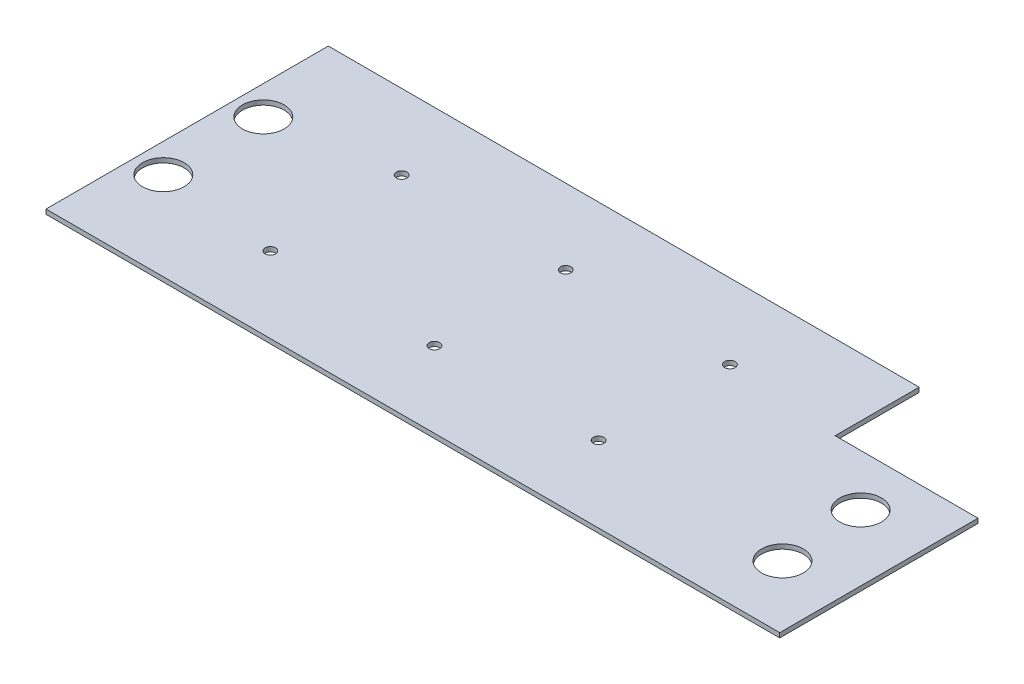
ISO-10303-21;
HEADER;
FILE_DESCRIPTION(('STEP AP214'),'2;1');
FILE_NAME('part.step','',(''),(''),'','','');
FILE_SCHEMA(('AUTOMOTIVE_DESIGN { 1 0 10303 214 1 1 1 1 }'));
ENDSEC;
DATA;
#1=APPLICATION_CONTEXT('core data for automotive mechanical design processes');
#2=APPLICATION_PROTOCOL_DEFINITION('international standard','automotive_design',2000,#1);
#3=PRODUCT_CONTEXT('',#1,'mechanical');
#4=PRODUCT('Part','Part','',(#3));
#5=PRODUCT_RELATED_PRODUCT_CATEGORY('part','',(#4));
#6=PRODUCT_DEFINITION_FORMATION('','',#4);
#7=PRODUCT_DEFINITION_CONTEXT('part definition',#1,'design');
#8=PRODUCT_DEFINITION('design','',#6,#7);
#9=PRODUCT_DEFINITION_SHAPE('','',#8);
#10=(LENGTH_UNIT() NAMED_UNIT(*) SI_UNIT(.MILLI.,.METRE.));
#11=(NAMED_UNIT(*) PLANE_ANGLE_UNIT() SI_UNIT($,.RADIAN.));
#12=(NAMED_UNIT(*) SI_UNIT($,.STERADIAN.) SOLID_ANGLE_UNIT());
#13=UNCERTAINTY_MEASURE_WITH_UNIT(LENGTH_MEASURE(1.E-05),#10,'distance_accuracy_value','');
#14=(GEOMETRIC_REPRESENTATION_CONTEXT(3) GLOBAL_UNCERTAINTY_ASSIGNED_CONTEXT((#13)) GLOBAL_UNIT_ASSIGNED_CONTEXT((#10,
#11,#12)) REPRESENTATION_CONTEXT('',''));
#15=CARTESIAN_POINT('',(0.,0.,0.));
#16=DIRECTION('',(0.,0.,1.));
#17=DIRECTION('',(1.,0.,0.));
#18=AXIS2_PLACEMENT_3D('',#15,#16,#17);
#19=CARTESIAN_POINT('',(558.8,3.5,0.));
#20=DIRECTION('',(0.,0.,-1.));
#21=DIRECTION('',(-1.,0.,0.));
#22=AXIS2_PLACEMENT_3D('',#19,#20,#21);
#23=PLANE('',#22);
#24=DIRECTION('',(1.,0.,0.));
#25=VECTOR('',#24,1.);
#26=CARTESIAN_POINT('',(558.8,0.,0.));
#27=LINE('',#26,#25);
#28=CARTESIAN_POINT('',(0.,0.,0.));
#29=VERTEX_POINT('',#28);
#30=CARTESIAN_POINT('',(558.8,0.,0.));
#31=VERTEX_POINT('',#30);
#32=EDGE_CURVE('E128',#29,#31,#27,.T.);
#33=ORIENTED_EDGE('',*,*,#32,.T.);
#34=DIRECTION('',(0.,-1.,0.));
#35=VECTOR('',#34,1.);
#36=CARTESIAN_POINT('',(558.8,3.5,0.));
#37=LINE('',#36,#35);
#38=CARTESIAN_POINT('',(558.8,3.5,0.));
#39=VERTEX_POINT('',#38);
#40=EDGE_CURVE('E11',#39,#31,#37,.T.);
#41=ORIENTED_EDGE('',*,*,#40,.F.);
#42=DIRECTION('',(1.,0.,0.));
#43=VECTOR('',#42,1.);
#44=CARTESIAN_POINT('',(558.8,3.5,0.));
#45=LINE('',#44,#43);
#46=CARTESIAN_POINT('',(0.,3.5,0.));
#47=VERTEX_POINT('',#46);
#48=EDGE_CURVE('E136',#47,#39,#45,.T.);
#49=ORIENTED_EDGE('',*,*,#48,.F.);
#50=DIRECTION('',(0.,-1.,0.));
#51=VECTOR('',#50,1.);
#52=CARTESIAN_POINT('',(0.,3.5,0.));
#53=LINE('',#52,#51);
#54=EDGE_CURVE('E123',#47,#29,#53,.T.);
#55=ORIENTED_EDGE('',*,*,#54,.T.);
#56=EDGE_LOOP('',(#33,#41,#49,#55));
#57=FACE_BOUND('',#56,.T.);
#58=ADVANCED_FACE('F43',(#57),#23,.F.);
#59=CARTESIAN_POINT('',(558.8,3.5,-151.));
#60=DIRECTION('',(-1.,0.,0.));
#61=DIRECTION('',(0.,0.,1.));
#62=AXIS2_PLACEMENT_3D('',#59,#60,#61);
#63=PLANE('',#62);
#64=DIRECTION('',(0.,0.,-1.));
#65=VECTOR('',#64,1.);
#66=CARTESIAN_POINT('',(558.8,0.,-151.));
#67=LINE('',#66,#65);
#68=CARTESIAN_POINT('',(558.8,0.,-151.));
#69=VERTEX_POINT('',#68);
#70=EDGE_CURVE('E135',#31,#69,#67,.T.);
#71=ORIENTED_EDGE('',*,*,#70,.T.);
#72=DIRECTION('',(0.,-1.,0.));
#73=VECTOR('',#72,1.);
#74=CARTESIAN_POINT('',(558.8,3.5,-151.));
#75=LINE('',#74,#73);
#76=CARTESIAN_POINT('',(558.8,3.5,-151.));
#77=VERTEX_POINT('',#76);
#78=EDGE_CURVE('E55',#77,#69,#75,.T.);
#79=ORIENTED_EDGE('',*,*,#78,.F.);
#80=DIRECTION('',(0.,0.,-1.));
#81=VECTOR('',#80,1.);
#82=CARTESIAN_POINT('',(558.8,3.5,-151.));
#83=LINE('',#82,#81);
#84=EDGE_CURVE('E96',#39,#77,#83,.T.);
#85=ORIENTED_EDGE('',*,*,#84,.F.);
#86=ORIENTED_EDGE('',*,*,#40,.T.);
#87=EDGE_LOOP('',(#71,#79,#85,#86));
#88=FACE_BOUND('',#87,.T.);
#89=ADVANCED_FACE('F193',(#88),#63,.F.);
#90=CARTESIAN_POINT('',(450.,3.5,-151.));
#91=DIRECTION('',(0.,0.,1.));
#92=DIRECTION('',(1.,0.,0.));
#93=AXIS2_PLACEMENT_3D('',#90,#91,#92);
#94=PLANE('',#93);
#95=DIRECTION('',(-1.,0.,0.));
#96=VECTOR('',#95,1.);
#97=CARTESIAN_POINT('',(450.,0.,-151.));
#98=LINE('',#97,#96);
#99=CARTESIAN_POINT('',(450.,0.,-151.));
#100=VERTEX_POINT('',#99);
#101=EDGE_CURVE('E134',#69,#100,#98,.T.);
#102=ORIENTED_EDGE('',*,*,#101,.T.);
#103=DIRECTION('',(0.,-1.,0.));
#104=VECTOR('',#103,1.);
#105=CARTESIAN_POINT('',(450.,3.5,-151.));
#106=LINE('',#105,#104);
#107=CARTESIAN_POINT('',(450.,3.5,-151.));
#108=VERTEX_POINT('',#107);
#109=EDGE_CURVE('E119',#108,#100,#106,.T.);
#110=ORIENTED_EDGE('',*,*,#109,.F.);
#111=DIRECTION('',(-1.,0.,0.));
#112=VECTOR('',#111,1.);
#113=CARTESIAN_POINT('',(450.,3.5,-151.));
#114=LINE('',#113,#112);
#115=EDGE_CURVE('E111',#77,#108,#114,.T.);
#116=ORIENTED_EDGE('',*,*,#115,.F.);
#117=ORIENTED_EDGE('',*,*,#78,.T.);
#118=EDGE_LOOP('',(#102,#110,#116,#117));
#119=FACE_BOUND('',#118,.T.);
#120=ADVANCED_FACE('F200',(#119),#94,.F.);
#121=CARTESIAN_POINT('',(450.,3.5,-215.));
#122=DIRECTION('',(-1.,0.,0.));
#123=DIRECTION('',(0.,0.,1.));
#124=AXIS2_PLACEMENT_3D('',#121,#122,#123);
#125=PLANE('',#124);
#126=DIRECTION('',(0.,0.,-1.));
#127=VECTOR('',#126,1.);
#128=CARTESIAN_POINT('',(450.,0.,-215.));
#129=LINE('',#128,#127);
#130=CARTESIAN_POINT('',(450.,0.,-215.));
#131=VERTEX_POINT('',#130);
#132=EDGE_CURVE('E118',#100,#131,#129,.T.);
#133=ORIENTED_EDGE('',*,*,#132,.T.);
#134=DIRECTION('',(0.,-1.,0.));
#135=VECTOR('',#134,1.);
#136=CARTESIAN_POINT('',(450.,3.5,-215.));
#137=LINE('',#136,#135);
#138=CARTESIAN_POINT('',(450.,3.5,-215.));
#139=VERTEX_POINT('',#138);
#140=EDGE_CURVE('E116',#139,#131,#137,.T.);
#141=ORIENTED_EDGE('',*,*,#140,.F.);
#142=DIRECTION('',(0.,0.,-1.));
#143=VECTOR('',#142,1.);
#144=CARTESIAN_POINT('',(450.,3.5,-215.));
#145=LINE('',#144,#143);
#146=EDGE_CURVE('E102',#108,#139,#145,.T.);
#147=ORIENTED_EDGE('',*,*,#146,.F.);
#148=ORIENTED_EDGE('',*,*,#109,.T.);
#149=EDGE_LOOP('',(#133,#141,#147,#148));
#150=FACE_BOUND('',#149,.T.);
#151=ADVANCED_FACE('F120',(#150),#125,.F.);
#152=CARTESIAN_POINT('',(0.,3.5,-215.));
#153=DIRECTION('',(0.,0.,1.));
#154=DIRECTION('',(1.,0.,0.));
#155=AXIS2_PLACEMENT_3D('',#152,#153,#154);
#156=PLANE('',#155);
#157=DIRECTION('',(-1.,0.,0.));
#158=VECTOR('',#157,1.);
#159=CARTESIAN_POINT('',(0.,0.,-215.));
#160=LINE('',#159,#158);
#161=CARTESIAN_POINT('',(0.,0.,-215.));
#162=VERTEX_POINT('',#161);
#163=EDGE_CURVE('E83',#131,#162,#160,.T.);
#164=ORIENTED_EDGE('',*,*,#163,.T.);
#165=DIRECTION('',(0.,-1.,0.));
#166=VECTOR('',#165,1.);
#167=CARTESIAN_POINT('',(0.,3.5,-215.));
#168=LINE('',#167,#166);
#169=CARTESIAN_POINT('',(0.,3.5,-215.));
#170=VERTEX_POINT('',#169);
#171=EDGE_CURVE('E122',#170,#162,#168,.T.);
#172=ORIENTED_EDGE('',*,*,#171,.F.);
#173=DIRECTION('',(-1.,0.,0.));
#174=VECTOR('',#173,1.);
#175=CARTESIAN_POINT('',(0.,3.5,-215.));
#176=LINE('',#175,#174);
#177=EDGE_CURVE('E107',#139,#170,#176,.T.);
#178=ORIENTED_EDGE('',*,*,#177,.F.);
#179=ORIENTED_EDGE('',*,*,#140,.T.);
#180=EDGE_LOOP('',(#164,#172,#178,#179));
#181=FACE_BOUND('',#180,.T.);
#182=ADVANCED_FACE('F124',(#181),#156,.F.);
#183=CARTESIAN_POINT('',(0.,3.5,0.));
#184=DIRECTION('',(1.,0.,0.));
#185=DIRECTION('',(0.,0.,-1.));
#186=AXIS2_PLACEMENT_3D('',#183,#184,#185);
#187=PLANE('',#186);
#188=DIRECTION('',(0.,0.,1.));
#189=VECTOR('',#188,1.);
#190=CARTESIAN_POINT('',(0.,0.,0.));
#191=LINE('',#190,#189);
#192=EDGE_CURVE('E89',#162,#29,#191,.T.);
#193=ORIENTED_EDGE('',*,*,#192,.T.);
#194=ORIENTED_EDGE('',*,*,#54,.F.);
#195=DIRECTION('',(0.,0.,1.));
#196=VECTOR('',#195,1.);
#197=CARTESIAN_POINT('',(0.,3.5,0.));
#198=LINE('',#197,#196);
#199=EDGE_CURVE('E61',#170,#47,#198,.T.);
#200=ORIENTED_EDGE('',*,*,#199,.F.);
#201=ORIENTED_EDGE('',*,*,#171,.T.);
#202=EDGE_LOOP('',(#193,#194,#200,#201));
#203=FACE_BOUND('',#202,.T.);
#204=ADVANCED_FACE('F204',(#203),#187,.F.);
#205=CARTESIAN_POINT('',(0.,3.5,0.));
#206=DIRECTION('',(0.,-1.,0.));
#207=DIRECTION('',(0.,0.,-1.));
#208=AXIS2_PLACEMENT_3D('',#205,#206,#207);
#209=PLANE('',#208);
#210=CARTESIAN_POINT('',(21.9771584819898,3.5,-143.521297983205));
#211=DIRECTION('',(0.,1.,0.));
#212=DIRECTION('',(0.,0.,1.));
#213=AXIS2_PLACEMENT_3D('',#210,#211,#212);
#214=CIRCLE('',#213,15.875);
#215=CARTESIAN_POINT('',(21.9771584819898,3.5,-127.646297983205));
#216=VERTEX_POINT('',#215);
#217=EDGE_CURVE('E149',#216,#216,#214,.T.);
#218=ORIENTED_EDGE('',*,*,#217,.F.);
#219=EDGE_LOOP('',(#218));
#220=FACE_BOUND('',#219,.T.);
#221=CARTESIAN_POINT('',(22.024999999998,3.5,-67.32131300165));
#222=DIRECTION('',(0.,1.,0.));
#223=DIRECTION('',(0.,0.,1.));
#224=AXIS2_PLACEMENT_3D('',#221,#222,#223);
#225=CIRCLE('',#224,15.875);
#226=CARTESIAN_POINT('',(22.024999999998,3.5,-51.44631300165));
#227=VERTEX_POINT('',#226);
#228=EDGE_CURVE('E351',#227,#227,#225,.T.);
#229=ORIENTED_EDGE('',*,*,#228,.F.);
#230=EDGE_LOOP('',(#229));
#231=FACE_BOUND('',#230,.T.);
#232=CARTESIAN_POINT('',(512.517444600135,3.5,-48.3496617312163));
#233=DIRECTION('',(0.,1.,0.));
#234=DIRECTION('',(0.,0.,1.));
#235=AXIS2_PLACEMENT_3D('',#232,#233,#234);
#236=CIRCLE('',#235,15.875);
#237=CARTESIAN_POINT('',(512.517444600135,3.5,-32.4746617312163));
#238=VERTEX_POINT('',#237);
#239=EDGE_CURVE('E356',#238,#238,#236,.T.);
#240=ORIENTED_EDGE('',*,*,#239,.F.);
#241=EDGE_LOOP('',(#240));
#242=FACE_BOUND('',#241,.T.);
#243=CARTESIAN_POINT('',(508.667649246363,3.5,-111.732854106909));
#244=DIRECTION('',(0.,1.,0.));
#245=DIRECTION('',(0.,0.,1.));
#246=AXIS2_PLACEMENT_3D('',#243,#244,#245);
#247=CIRCLE('',#246,15.875);
#248=CARTESIAN_POINT('',(508.667649246363,3.5,-95.8578541069091));
#249=VERTEX_POINT('',#248);
#250=EDGE_CURVE('E361',#249,#249,#247,.T.);
#251=ORIENTED_EDGE('',*,*,#250,.F.);
#252=EDGE_LOOP('',(#251));
#253=FACE_BOUND('',#252,.T.);
#254=CARTESIAN_POINT('',(113.,3.5,-57.85));
#255=DIRECTION('',(0.,-1.,0.));
#256=DIRECTION('',(0.,0.,-1.));
#257=AXIS2_PLACEMENT_3D('',#254,#255,#256);
#258=CIRCLE('',#257,4.00000000000001);
#259=CARTESIAN_POINT('',(113.,3.5,-61.85));
#260=VERTEX_POINT('',#259);
#261=EDGE_CURVE('E131',#260,#260,#258,.T.);
#262=ORIENTED_EDGE('',*,*,#261,.T.);
#263=EDGE_LOOP('',(#262));
#264=FACE_BOUND('',#263,.T.);
#265=CARTESIAN_POINT('',(238.,3.5,-57.85));
#266=DIRECTION('',(0.,-1.,0.));
#267=DIRECTION('',(0.,0.,-1.));
#268=AXIS2_PLACEMENT_3D('',#265,#266,#267);
#269=CIRCLE('',#268,3.99999999999999);
#270=CARTESIAN_POINT('',(238.,3.5,-61.85));
#271=VERTEX_POINT('',#270);
#272=EDGE_CURVE('E187',#271,#271,#269,.T.);
#273=ORIENTED_EDGE('',*,*,#272,.T.);
#274=EDGE_LOOP('',(#273));
#275=FACE_BOUND('',#274,.T.);
#276=CARTESIAN_POINT('',(363.,3.5,-57.85));
#277=DIRECTION('',(0.,-1.,0.));
#278=DIRECTION('',(0.,0.,-1.));
#279=AXIS2_PLACEMENT_3D('',#276,#277,#278);
#280=CIRCLE('',#279,3.99999999999999);
#281=CARTESIAN_POINT('',(363.,3.5,-61.85));
#282=VERTEX_POINT('',#281);
#283=EDGE_CURVE('E182',#282,#282,#280,.T.);
#284=ORIENTED_EDGE('',*,*,#283,.T.);
#285=EDGE_LOOP('',(#284));
#286=FACE_BOUND('',#285,.T.);
#287=CARTESIAN_POINT('',(363.,3.5,-157.85));
#288=DIRECTION('',(0.,-1.,0.));
#289=DIRECTION('',(0.,0.,-1.));
#290=AXIS2_PLACEMENT_3D('',#287,#288,#289);
#291=CIRCLE('',#290,3.99999999999999);
#292=CARTESIAN_POINT('',(363.,3.5,-161.85));
#293=VERTEX_POINT('',#292);
#294=EDGE_CURVE('E179',#293,#293,#291,.T.);
#295=ORIENTED_EDGE('',*,*,#294,.T.);
#296=EDGE_LOOP('',(#295));
#297=FACE_BOUND('',#296,.T.);
#298=CARTESIAN_POINT('',(238.,3.5,-157.85));
#299=DIRECTION('',(0.,-1.,0.));
#300=DIRECTION('',(0.,0.,-1.));
#301=AXIS2_PLACEMENT_3D('',#298,#299,#300);
#302=CIRCLE('',#301,3.99999999999999);
#303=CARTESIAN_POINT('',(238.,3.5,-161.85));
#304=VERTEX_POINT('',#303);
#305=EDGE_CURVE('E180',#304,#304,#302,.T.);
#306=ORIENTED_EDGE('',*,*,#305,.T.);
#307=EDGE_LOOP('',(#306));
#308=FACE_BOUND('',#307,.T.);
#309=CARTESIAN_POINT('',(113.,3.5,-157.85));
#310=DIRECTION('',(0.,-1.,0.));
#311=DIRECTION('',(0.,0.,-1.));
#312=AXIS2_PLACEMENT_3D('',#309,#310,#311);
#313=CIRCLE('',#312,4.00000000000001);
#314=CARTESIAN_POINT('',(113.,3.5,-161.85));
#315=VERTEX_POINT('',#314);
#316=EDGE_CURVE('E173',#315,#315,#313,.T.);
#317=ORIENTED_EDGE('',*,*,#316,.T.);
#318=EDGE_LOOP('',(#317));
#319=FACE_BOUND('',#318,.T.);
#320=ORIENTED_EDGE('',*,*,#48,.T.);
#321=ORIENTED_EDGE('',*,*,#84,.T.);
#322=ORIENTED_EDGE('',*,*,#115,.T.);
#323=ORIENTED_EDGE('',*,*,#146,.T.);
#324=ORIENTED_EDGE('',*,*,#177,.T.);
#325=ORIENTED_EDGE('',*,*,#199,.T.);
#326=EDGE_LOOP('',(#320,#321,#322,#323,#324,#325));
#327=FACE_BOUND('',#326,.T.);
#328=ADVANCED_FACE('F110',(#220,#231,#242,#253,#264,#275,#286,#297,#308,#319,#327),#209,.F.);
#329=CARTESIAN_POINT('',(0.,0.,0.));
#330=DIRECTION('',(0.,-1.,0.));
#331=DIRECTION('',(0.,0.,-1.));
#332=AXIS2_PLACEMENT_3D('',#329,#330,#331);
#333=PLANE('',#332);
#334=CARTESIAN_POINT('',(21.9771584819898,0.,-143.521297983205));
#335=DIRECTION('',(0.,-1.,0.));
#336=DIRECTION('',(0.,0.,-1.));
#337=AXIS2_PLACEMENT_3D('',#334,#335,#336);
#338=CIRCLE('',#337,15.875);
#339=CARTESIAN_POINT('',(21.9771584819898,0.,-159.396297983205));
#340=VERTEX_POINT('',#339);
#341=EDGE_CURVE('E46',#340,#340,#338,.T.);
#342=ORIENTED_EDGE('',*,*,#341,.F.);
#343=EDGE_LOOP('',(#342));
#344=FACE_BOUND('',#343,.T.);
#345=CARTESIAN_POINT('',(22.024999999998,0.,-67.32131300165));
#346=DIRECTION('',(0.,-1.,0.));
#347=DIRECTION('',(0.,0.,-1.));
#348=AXIS2_PLACEMENT_3D('',#345,#346,#347);
#349=CIRCLE('',#348,15.875);
#350=CARTESIAN_POINT('',(22.024999999998,0.,-83.19631300165));
#351=VERTEX_POINT('',#350);
#352=EDGE_CURVE('E155',#351,#351,#349,.T.);
#353=ORIENTED_EDGE('',*,*,#352,.F.);
#354=EDGE_LOOP('',(#353));
#355=FACE_BOUND('',#354,.T.);
#356=CARTESIAN_POINT('',(512.517444600135,0.,-48.3496617312163));
#357=DIRECTION('',(0.,-1.,0.));
#358=DIRECTION('',(0.,0.,-1.));
#359=AXIS2_PLACEMENT_3D('',#356,#357,#358);
#360=CIRCLE('',#359,15.875);
#361=CARTESIAN_POINT('',(512.517444600135,0.,-64.2246617312162));
#362=VERTEX_POINT('',#361);
#363=EDGE_CURVE('E148',#362,#362,#360,.T.);
#364=ORIENTED_EDGE('',*,*,#363,.F.);
#365=EDGE_LOOP('',(#364));
#366=FACE_BOUND('',#365,.T.);
#367=CARTESIAN_POINT('',(508.667649246363,0.,-111.732854106909));
#368=DIRECTION('',(0.,-1.,0.));
#369=DIRECTION('',(0.,0.,-1.));
#370=AXIS2_PLACEMENT_3D('',#367,#368,#369);
#371=CIRCLE('',#370,15.875);
#372=CARTESIAN_POINT('',(508.667649246363,0.,-127.607854106909));
#373=VERTEX_POINT('',#372);
#374=EDGE_CURVE('E146',#373,#373,#371,.T.);
#375=ORIENTED_EDGE('',*,*,#374,.F.);
#376=EDGE_LOOP('',(#375));
#377=FACE_BOUND('',#376,.T.);
#378=CARTESIAN_POINT('',(113.,0.,-57.85));
#379=DIRECTION('',(0.,1.,0.));
#380=DIRECTION('',(0.,0.,1.));
#381=AXIS2_PLACEMENT_3D('',#378,#379,#380);
#382=CIRCLE('',#381,4.00000000000001);
#383=CARTESIAN_POINT('',(113.,0.,-53.85));
#384=VERTEX_POINT('',#383);
#385=EDGE_CURVE('E159',#384,#384,#382,.T.);
#386=ORIENTED_EDGE('',*,*,#385,.T.);
#387=EDGE_LOOP('',(#386));
#388=FACE_BOUND('',#387,.T.);
#389=CARTESIAN_POINT('',(238.,0.,-57.85));
#390=DIRECTION('',(0.,1.,0.));
#391=DIRECTION('',(0.,0.,1.));
#392=AXIS2_PLACEMENT_3D('',#389,#390,#391);
#393=CIRCLE('',#392,3.99999999999999);
#394=CARTESIAN_POINT('',(238.,0.,-53.85));
#395=VERTEX_POINT('',#394);
#396=EDGE_CURVE('E163',#395,#395,#393,.T.);
#397=ORIENTED_EDGE('',*,*,#396,.T.);
#398=EDGE_LOOP('',(#397));
#399=FACE_BOUND('',#398,.T.);
#400=CARTESIAN_POINT('',(363.,0.,-57.85));
#401=DIRECTION('',(0.,1.,0.));
#402=DIRECTION('',(0.,0.,1.));
#403=AXIS2_PLACEMENT_3D('',#400,#401,#402);
#404=CIRCLE('',#403,3.99999999999999);
#405=CARTESIAN_POINT('',(363.,0.,-53.85));
#406=VERTEX_POINT('',#405);
#407=EDGE_CURVE('E168',#406,#406,#404,.T.);
#408=ORIENTED_EDGE('',*,*,#407,.T.);
#409=EDGE_LOOP('',(#408));
#410=FACE_BOUND('',#409,.T.);
#411=CARTESIAN_POINT('',(363.,0.,-157.85));
#412=DIRECTION('',(0.,1.,0.));
#413=DIRECTION('',(0.,0.,1.));
#414=AXIS2_PLACEMENT_3D('',#411,#412,#413);
#415=CIRCLE('',#414,3.99999999999999);
#416=CARTESIAN_POINT('',(363.,0.,-153.85));
#417=VERTEX_POINT('',#416);
#418=EDGE_CURVE('E368',#417,#417,#415,.T.);
#419=ORIENTED_EDGE('',*,*,#418,.T.);
#420=EDGE_LOOP('',(#419));
#421=FACE_BOUND('',#420,.T.);
#422=CARTESIAN_POINT('',(238.,0.,-157.85));
#423=DIRECTION('',(0.,1.,0.));
#424=DIRECTION('',(0.,0.,1.));
#425=AXIS2_PLACEMENT_3D('',#422,#423,#424);
#426=CIRCLE('',#425,3.99999999999999);
#427=CARTESIAN_POINT('',(238.,0.,-153.85));
#428=VERTEX_POINT('',#427);
#429=EDGE_CURVE('E172',#428,#428,#426,.T.);
#430=ORIENTED_EDGE('',*,*,#429,.T.);
#431=EDGE_LOOP('',(#430));
#432=FACE_BOUND('',#431,.T.);
#433=CARTESIAN_POINT('',(113.,0.,-157.85));
#434=DIRECTION('',(0.,1.,0.));
#435=DIRECTION('',(0.,0.,1.));
#436=AXIS2_PLACEMENT_3D('',#433,#434,#435);
#437=CIRCLE('',#436,4.00000000000001);
#438=CARTESIAN_POINT('',(113.,0.,-153.85));
#439=VERTEX_POINT('',#438);
#440=EDGE_CURVE('E167',#439,#439,#437,.T.);
#441=ORIENTED_EDGE('',*,*,#440,.T.);
#442=EDGE_LOOP('',(#441));
#443=FACE_BOUND('',#442,.T.);
#444=ORIENTED_EDGE('',*,*,#32,.F.);
#445=ORIENTED_EDGE('',*,*,#192,.F.);
#446=ORIENTED_EDGE('',*,*,#163,.F.);
#447=ORIENTED_EDGE('',*,*,#132,.F.);
#448=ORIENTED_EDGE('',*,*,#101,.F.);
#449=ORIENTED_EDGE('',*,*,#70,.F.);
#450=EDGE_LOOP('',(#444,#445,#446,#447,#448,#449));
#451=FACE_BOUND('',#450,.T.);
#452=ADVANCED_FACE('F199',(#344,#355,#366,#377,#388,#399,#410,#421,#432,#443,#451),#333,.T.);
#453=CARTESIAN_POINT('',(113.,0.,-157.85));
#454=DIRECTION('',(0.,1.,0.));
#455=DIRECTION('',(0.,0.,1.));
#456=AXIS2_PLACEMENT_3D('',#453,#454,#455);
#457=CYLINDRICAL_SURFACE('',#456,4.00000000000001);
#458=ORIENTED_EDGE('',*,*,#440,.F.);
#459=EDGE_LOOP('',(#458));
#460=FACE_BOUND('',#459,.T.);
#461=ORIENTED_EDGE('',*,*,#316,.F.);
#462=EDGE_LOOP('',(#461));
#463=FACE_BOUND('',#462,.T.);
#464=ADVANCED_FACE('F251',(#460,#463),#457,.F.);
#465=CARTESIAN_POINT('',(238.,0.,-157.85));
#466=DIRECTION('',(0.,1.,0.));
#467=DIRECTION('',(0.,0.,1.));
#468=AXIS2_PLACEMENT_3D('',#465,#466,#467);
#469=CYLINDRICAL_SURFACE('',#468,3.99999999999999);
#470=ORIENTED_EDGE('',*,*,#429,.F.);
#471=EDGE_LOOP('',(#470));
#472=FACE_BOUND('',#471,.T.);
#473=ORIENTED_EDGE('',*,*,#305,.F.);
#474=EDGE_LOOP('',(#473));
#475=FACE_BOUND('',#474,.T.);
#476=ADVANCED_FACE('F261',(#472,#475),#469,.F.);
#477=CARTESIAN_POINT('',(363.,0.,-157.85));
#478=DIRECTION('',(0.,1.,0.));
#479=DIRECTION('',(0.,0.,1.));
#480=AXIS2_PLACEMENT_3D('',#477,#478,#479);
#481=CYLINDRICAL_SURFACE('',#480,3.99999999999999);
#482=ORIENTED_EDGE('',*,*,#418,.F.);
#483=EDGE_LOOP('',(#482));
#484=FACE_BOUND('',#483,.T.);
#485=ORIENTED_EDGE('',*,*,#294,.F.);
#486=EDGE_LOOP('',(#485));
#487=FACE_BOUND('',#486,.T.);
#488=ADVANCED_FACE('F271',(#484,#487),#481,.F.);
#489=CARTESIAN_POINT('',(363.,0.,-57.85));
#490=DIRECTION('',(0.,1.,0.));
#491=DIRECTION('',(0.,0.,1.));
#492=AXIS2_PLACEMENT_3D('',#489,#490,#491);
#493=CYLINDRICAL_SURFACE('',#492,3.99999999999999);
#494=ORIENTED_EDGE('',*,*,#407,.F.);
#495=EDGE_LOOP('',(#494));
#496=FACE_BOUND('',#495,.T.);
#497=ORIENTED_EDGE('',*,*,#283,.F.);
#498=EDGE_LOOP('',(#497));
#499=FACE_BOUND('',#498,.T.);
#500=ADVANCED_FACE('F281',(#496,#499),#493,.F.);
#501=CARTESIAN_POINT('',(238.,0.,-57.85));
#502=DIRECTION('',(0.,1.,0.));
#503=DIRECTION('',(0.,0.,1.));
#504=AXIS2_PLACEMENT_3D('',#501,#502,#503);
#505=CYLINDRICAL_SURFACE('',#504,3.99999999999999);
#506=ORIENTED_EDGE('',*,*,#396,.F.);
#507=EDGE_LOOP('',(#506));
#508=FACE_BOUND('',#507,.T.);
#509=ORIENTED_EDGE('',*,*,#272,.F.);
#510=EDGE_LOOP('',(#509));
#511=FACE_BOUND('',#510,.T.);
#512=ADVANCED_FACE('F291',(#508,#511),#505,.F.);
#513=CARTESIAN_POINT('',(113.,0.,-57.85));
#514=DIRECTION('',(0.,1.,0.));
#515=DIRECTION('',(0.,0.,1.));
#516=AXIS2_PLACEMENT_3D('',#513,#514,#515);
#517=CYLINDRICAL_SURFACE('',#516,4.00000000000001);
#518=ORIENTED_EDGE('',*,*,#385,.F.);
#519=EDGE_LOOP('',(#518));
#520=FACE_BOUND('',#519,.T.);
#521=ORIENTED_EDGE('',*,*,#261,.F.);
#522=EDGE_LOOP('',(#521));
#523=FACE_BOUND('',#522,.T.);
#524=ADVANCED_FACE('F303',(#520,#523),#517,.F.);
#525=CARTESIAN_POINT('',(508.667649246363,-6.5,-111.732854106909));
#526=DIRECTION('',(0.,1.,0.));
#527=DIRECTION('',(0.,0.,1.));
#528=AXIS2_PLACEMENT_3D('',#525,#526,#527);
#529=CYLINDRICAL_SURFACE('',#528,15.875);
#530=ORIENTED_EDGE('',*,*,#374,.T.);
#531=EDGE_LOOP('',(#530));
#532=FACE_BOUND('',#531,.T.);
#533=ORIENTED_EDGE('',*,*,#250,.T.);
#534=EDGE_LOOP('',(#533));
#535=FACE_BOUND('',#534,.T.);
#536=ADVANCED_FACE('F315',(#532,#535),#529,.F.);
#537=CARTESIAN_POINT('',(512.517444600135,-6.5,-48.3496617312163));
#538=DIRECTION('',(0.,1.,0.));
#539=DIRECTION('',(0.,0.,1.));
#540=AXIS2_PLACEMENT_3D('',#537,#538,#539);
#541=CYLINDRICAL_SURFACE('',#540,15.875);
#542=ORIENTED_EDGE('',*,*,#363,.T.);
#543=EDGE_LOOP('',(#542));
#544=FACE_BOUND('',#543,.T.);
#545=ORIENTED_EDGE('',*,*,#239,.T.);
#546=EDGE_LOOP('',(#545));
#547=FACE_BOUND('',#546,.T.);
#548=ADVANCED_FACE('F321',(#544,#547),#541,.F.);
#549=CARTESIAN_POINT('',(22.024999999998,-6.5,-67.32131300165));
#550=DIRECTION('',(0.,1.,0.));
#551=DIRECTION('',(0.,0.,1.));
#552=AXIS2_PLACEMENT_3D('',#549,#550,#551);
#553=CYLINDRICAL_SURFACE('',#552,15.875);
#554=ORIENTED_EDGE('',*,*,#352,.T.);
#555=EDGE_LOOP('',(#554));
#556=FACE_BOUND('',#555,.T.);
#557=ORIENTED_EDGE('',*,*,#228,.T.);
#558=EDGE_LOOP('',(#557));
#559=FACE_BOUND('',#558,.T.);
#560=ADVANCED_FACE('F333',(#556,#559),#553,.F.);
#561=CARTESIAN_POINT('',(21.9771584819898,-6.5,-143.521297983205));
#562=DIRECTION('',(0.,1.,0.));
#563=DIRECTION('',(0.,0.,1.));
#564=AXIS2_PLACEMENT_3D('',#561,#562,#563);
#565=CYLINDRICAL_SURFACE('',#564,15.875);
#566=ORIENTED_EDGE('',*,*,#341,.T.);
#567=EDGE_LOOP('',(#566));
#568=FACE_BOUND('',#567,.T.);
#569=ORIENTED_EDGE('',*,*,#217,.T.);
#570=EDGE_LOOP('',(#569));
#571=FACE_BOUND('',#570,.T.);
#572=ADVANCED_FACE('F341',(#568,#571),#565,.F.);
#573=CLOSED_SHELL('',(#58,#89,#120,#151,#182,#204,#328,#452,#464,#476,#488,#500,#512,#524,#536,
#548,#560,#572));
#574=MANIFOLD_SOLID_BREP('B2',#573);
#575=ADVANCED_BREP_SHAPE_REPRESENTATION('',(#18,#574),#14);
#576=SHAPE_DEFINITION_REPRESENTATION(#9,#575);
ENDSEC;
END-ISO-10303-21;
